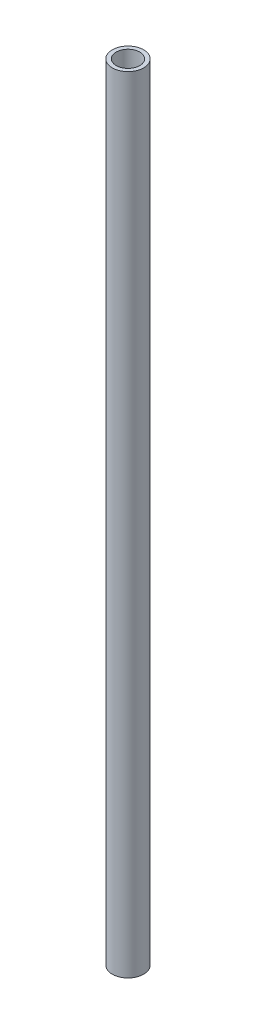
ISO-10303-21;
HEADER;
FILE_DESCRIPTION(('STEP AP214'),'2;1');
FILE_NAME('part.step','',(''),(''),'','','');
FILE_SCHEMA(('AUTOMOTIVE_DESIGN { 1 0 10303 214 1 1 1 1 }'));
ENDSEC;
DATA;
#1=APPLICATION_CONTEXT('core data for automotive mechanical design processes');
#2=APPLICATION_PROTOCOL_DEFINITION('international standard','automotive_design',2000,#1);
#3=PRODUCT_CONTEXT('',#1,'mechanical');
#4=PRODUCT('Part','Part','',(#3));
#5=PRODUCT_RELATED_PRODUCT_CATEGORY('part','',(#4));
#6=PRODUCT_DEFINITION_FORMATION('','',#4);
#7=PRODUCT_DEFINITION_CONTEXT('part definition',#1,'design');
#8=PRODUCT_DEFINITION('design','',#6,#7);
#9=PRODUCT_DEFINITION_SHAPE('','',#8);
#10=(LENGTH_UNIT() NAMED_UNIT(*) SI_UNIT(.MILLI.,.METRE.));
#11=(NAMED_UNIT(*) PLANE_ANGLE_UNIT() SI_UNIT($,.RADIAN.));
#12=(NAMED_UNIT(*) SI_UNIT($,.STERADIAN.) SOLID_ANGLE_UNIT());
#13=UNCERTAINTY_MEASURE_WITH_UNIT(LENGTH_MEASURE(1.E-05),#10,'distance_accuracy_value','');
#14=(GEOMETRIC_REPRESENTATION_CONTEXT(3) GLOBAL_UNCERTAINTY_ASSIGNED_CONTEXT((#13)) GLOBAL_UNIT_ASSIGNED_CONTEXT((#10,
#11,#12)) REPRESENTATION_CONTEXT('',''));
#15=CARTESIAN_POINT('',(0.,0.,0.));
#16=DIRECTION('',(0.,0.,1.));
#17=DIRECTION('',(1.,0.,0.));
#18=AXIS2_PLACEMENT_3D('',#15,#16,#17);
#19=CARTESIAN_POINT('',(0.,1000.,0.));
#20=DIRECTION('',(0.,1.,0.));
#21=DIRECTION('',(0.,0.,1.));
#22=AXIS2_PLACEMENT_3D('',#19,#20,#21);
#23=PLANE('',#22);
#24=CARTESIAN_POINT('',(0.,1000.,0.));
#25=DIRECTION('',(0.,1.,0.));
#26=DIRECTION('',(0.,0.,1.));
#27=AXIS2_PLACEMENT_3D('',#24,#25,#26);
#28=CIRCLE('',#27,20.);
#29=CARTESIAN_POINT('',(0.,1000.,20.));
#30=VERTEX_POINT('',#29);
#31=EDGE_CURVE('E10',#30,#30,#28,.T.);
#32=ORIENTED_EDGE('',*,*,#31,.T.);
#33=EDGE_LOOP('',(#32));
#34=FACE_BOUND('',#33,.T.);
#35=CARTESIAN_POINT('',(0.,1000.,0.));
#36=DIRECTION('',(0.,1.,0.));
#37=DIRECTION('',(0.,0.,1.));
#38=AXIS2_PLACEMENT_3D('',#35,#36,#37);
#39=CIRCLE('',#38,15.);
#40=CARTESIAN_POINT('',(0.,1000.,15.));
#41=VERTEX_POINT('',#40);
#42=EDGE_CURVE('E44',#41,#41,#39,.T.);
#43=ORIENTED_EDGE('',*,*,#42,.F.);
#44=EDGE_LOOP('',(#43));
#45=FACE_BOUND('',#44,.T.);
#46=ADVANCED_FACE('F33',(#34,#45),#23,.T.);
#47=CARTESIAN_POINT('',(0.,0.,0.));
#48=DIRECTION('',(0.,1.,0.));
#49=DIRECTION('',(0.,0.,1.));
#50=AXIS2_PLACEMENT_3D('',#47,#48,#49);
#51=PLANE('',#50);
#52=CARTESIAN_POINT('',(0.,0.,0.));
#53=DIRECTION('',(0.,1.,0.));
#54=DIRECTION('',(0.,0.,1.));
#55=AXIS2_PLACEMENT_3D('',#52,#53,#54);
#56=CIRCLE('',#55,20.);
#57=CARTESIAN_POINT('',(0.,0.,20.));
#58=VERTEX_POINT('',#57);
#59=EDGE_CURVE('E37',#58,#58,#56,.T.);
#60=ORIENTED_EDGE('',*,*,#59,.F.);
#61=EDGE_LOOP('',(#60));
#62=FACE_BOUND('',#61,.T.);
#63=CARTESIAN_POINT('',(0.,0.,0.));
#64=DIRECTION('',(0.,1.,0.));
#65=DIRECTION('',(0.,0.,1.));
#66=AXIS2_PLACEMENT_3D('',#63,#64,#65);
#67=CIRCLE('',#66,15.);
#68=CARTESIAN_POINT('',(0.,0.,15.));
#69=VERTEX_POINT('',#68);
#70=EDGE_CURVE('E46',#69,#69,#67,.T.);
#71=ORIENTED_EDGE('',*,*,#70,.T.);
#72=EDGE_LOOP('',(#71));
#73=FACE_BOUND('',#72,.T.);
#74=ADVANCED_FACE('F56',(#62,#73),#51,.F.);
#75=CARTESIAN_POINT('',(0.,1000.,0.));
#76=DIRECTION('',(0.,-1.,0.));
#77=DIRECTION('',(0.,0.,-1.));
#78=AXIS2_PLACEMENT_3D('',#75,#76,#77);
#79=CYLINDRICAL_SURFACE('',#78,20.);
#80=ORIENTED_EDGE('',*,*,#31,.F.);
#81=EDGE_LOOP('',(#80));
#82=FACE_BOUND('',#81,.T.);
#83=ORIENTED_EDGE('',*,*,#59,.T.);
#84=EDGE_LOOP('',(#83));
#85=FACE_BOUND('',#84,.T.);
#86=ADVANCED_FACE('F35',(#82,#85),#79,.T.);
#87=CARTESIAN_POINT('',(0.,1000.,0.));
#88=DIRECTION('',(0.,-1.,0.));
#89=DIRECTION('',(0.,0.,-1.));
#90=AXIS2_PLACEMENT_3D('',#87,#88,#89);
#91=CYLINDRICAL_SURFACE('',#90,15.);
#92=ORIENTED_EDGE('',*,*,#42,.T.);
#93=EDGE_LOOP('',(#92));
#94=FACE_BOUND('',#93,.T.);
#95=ORIENTED_EDGE('',*,*,#70,.F.);
#96=EDGE_LOOP('',(#95));
#97=FACE_BOUND('',#96,.T.);
#98=ADVANCED_FACE('F52',(#94,#97),#91,.F.);
#99=CLOSED_SHELL('',(#46,#74,#86,#98));
#100=MANIFOLD_SOLID_BREP('B2',#99);
#101=ADVANCED_BREP_SHAPE_REPRESENTATION('',(#18,#100),#14);
#102=SHAPE_DEFINITION_REPRESENTATION(#9,#101);
ENDSEC;
END-ISO-10303-21;
